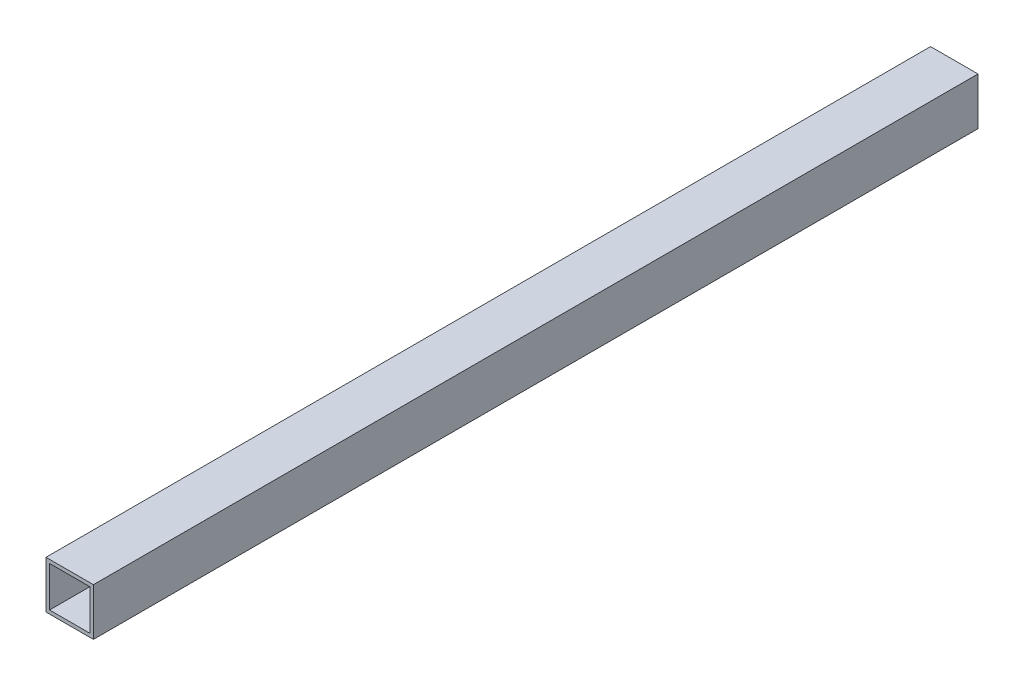
ISO-10303-21;
HEADER;
FILE_DESCRIPTION(('STEP AP214'),'2;1');
FILE_NAME('part.step','',(''),(''),'','','');
FILE_SCHEMA(('AUTOMOTIVE_DESIGN { 1 0 10303 214 1 1 1 1 }'));
ENDSEC;
DATA;
#1=APPLICATION_CONTEXT('core data for automotive mechanical design processes');
#2=APPLICATION_PROTOCOL_DEFINITION('international standard','automotive_design',2000,#1);
#3=PRODUCT_CONTEXT('',#1,'mechanical');
#4=PRODUCT('Part','Part','',(#3));
#5=PRODUCT_RELATED_PRODUCT_CATEGORY('part','',(#4));
#6=PRODUCT_DEFINITION_FORMATION('','',#4);
#7=PRODUCT_DEFINITION_CONTEXT('part definition',#1,'design');
#8=PRODUCT_DEFINITION('design','',#6,#7);
#9=PRODUCT_DEFINITION_SHAPE('','',#8);
#10=(LENGTH_UNIT() NAMED_UNIT(*) SI_UNIT(.MILLI.,.METRE.));
#11=(NAMED_UNIT(*) PLANE_ANGLE_UNIT() SI_UNIT($,.RADIAN.));
#12=(NAMED_UNIT(*) SI_UNIT($,.STERADIAN.) SOLID_ANGLE_UNIT());
#13=UNCERTAINTY_MEASURE_WITH_UNIT(LENGTH_MEASURE(1.E-05),#10,'distance_accuracy_value','');
#14=(GEOMETRIC_REPRESENTATION_CONTEXT(3) GLOBAL_UNCERTAINTY_ASSIGNED_CONTEXT((#13)) GLOBAL_UNIT_ASSIGNED_CONTEXT((#10,
#11,#12)) REPRESENTATION_CONTEXT('',''));
#15=CARTESIAN_POINT('',(0.,0.,0.));
#16=DIRECTION('',(0.,0.,1.));
#17=DIRECTION('',(1.,0.,0.));
#18=AXIS2_PLACEMENT_3D('',#15,#16,#17);
#19=CARTESIAN_POINT('',(0.,0.,373.));
#20=DIRECTION('',(0.,0.,1.));
#21=DIRECTION('',(1.,0.,0.));
#22=AXIS2_PLACEMENT_3D('',#19,#20,#21);
#23=PLANE('',#22);
#24=DIRECTION('',(0.,-1.,0.));
#25=VECTOR('',#24,1.);
#26=CARTESIAN_POINT('',(-10.,-10.,373.));
#27=LINE('',#26,#25);
#28=CARTESIAN_POINT('',(-10.,10.,373.));
#29=VERTEX_POINT('',#28);
#30=CARTESIAN_POINT('',(-10.,-10.,373.));
#31=VERTEX_POINT('',#30);
#32=EDGE_CURVE('E134',#29,#31,#27,.T.);
#33=ORIENTED_EDGE('',*,*,#32,.T.);
#34=DIRECTION('',(1.,0.,0.));
#35=VECTOR('',#34,1.);
#36=CARTESIAN_POINT('',(10.,-10.,373.));
#37=LINE('',#36,#35);
#38=CARTESIAN_POINT('',(10.,-10.,373.));
#39=VERTEX_POINT('',#38);
#40=EDGE_CURVE('E137',#31,#39,#37,.T.);
#41=ORIENTED_EDGE('',*,*,#40,.T.);
#42=DIRECTION('',(0.,1.,0.));
#43=VECTOR('',#42,1.);
#44=CARTESIAN_POINT('',(10.,-10.,373.));
#45=LINE('',#44,#43);
#46=CARTESIAN_POINT('',(10.,10.,373.));
#47=VERTEX_POINT('',#46);
#48=EDGE_CURVE('E140',#39,#47,#45,.T.);
#49=ORIENTED_EDGE('',*,*,#48,.T.);
#50=DIRECTION('',(-1.,0.,0.));
#51=VECTOR('',#50,1.);
#52=CARTESIAN_POINT('',(10.,10.,373.));
#53=LINE('',#52,#51);
#54=EDGE_CURVE('E142',#47,#29,#53,.T.);
#55=ORIENTED_EDGE('',*,*,#54,.T.);
#56=EDGE_LOOP('',(#33,#41,#49,#55));
#57=FACE_BOUND('',#56,.T.);
#58=DIRECTION('',(-1.,0.,0.));
#59=VECTOR('',#58,1.);
#60=CARTESIAN_POINT('',(8.5,8.5,373.));
#61=LINE('',#60,#59);
#62=CARTESIAN_POINT('',(8.5,8.5,373.));
#63=VERTEX_POINT('',#62);
#64=CARTESIAN_POINT('',(-8.5,8.49999999999999,373.));
#65=VERTEX_POINT('',#64);
#66=EDGE_CURVE('E106',#63,#65,#61,.T.);
#67=ORIENTED_EDGE('',*,*,#66,.F.);
#68=DIRECTION('',(0.,1.,0.));
#69=VECTOR('',#68,1.);
#70=CARTESIAN_POINT('',(8.5,-8.5,373.));
#71=LINE('',#70,#69);
#72=CARTESIAN_POINT('',(8.5,-8.5,373.));
#73=VERTEX_POINT('',#72);
#74=EDGE_CURVE('E98',#73,#63,#71,.T.);
#75=ORIENTED_EDGE('',*,*,#74,.F.);
#76=DIRECTION('',(1.,0.,0.));
#77=VECTOR('',#76,1.);
#78=CARTESIAN_POINT('',(8.5,-8.5,373.));
#79=LINE('',#78,#77);
#80=CARTESIAN_POINT('',(-8.5,-8.5,373.));
#81=VERTEX_POINT('',#80);
#82=EDGE_CURVE('E120',#81,#73,#79,.T.);
#83=ORIENTED_EDGE('',*,*,#82,.F.);
#84=DIRECTION('',(0.,-1.,0.));
#85=VECTOR('',#84,1.);
#86=CARTESIAN_POINT('',(-8.5,-8.5,373.));
#87=LINE('',#86,#85);
#88=EDGE_CURVE('E118',#65,#81,#87,.T.);
#89=ORIENTED_EDGE('',*,*,#88,.F.);
#90=EDGE_LOOP('',(#67,#75,#83,#89));
#91=FACE_BOUND('',#90,.T.);
#92=ADVANCED_FACE('F33',(#57,#91),#23,.T.);
#93=CARTESIAN_POINT('',(0.,0.,0.));
#94=DIRECTION('',(0.,0.,1.));
#95=DIRECTION('',(1.,0.,0.));
#96=AXIS2_PLACEMENT_3D('',#93,#94,#95);
#97=PLANE('',#96);
#98=DIRECTION('',(0.,-1.,0.));
#99=VECTOR('',#98,1.);
#100=CARTESIAN_POINT('',(-10.,-10.,0.));
#101=LINE('',#100,#99);
#102=CARTESIAN_POINT('',(-10.,10.,0.));
#103=VERTEX_POINT('',#102);
#104=CARTESIAN_POINT('',(-10.,-10.,0.));
#105=VERTEX_POINT('',#104);
#106=EDGE_CURVE('E114',#103,#105,#101,.T.);
#107=ORIENTED_EDGE('',*,*,#106,.F.);
#108=DIRECTION('',(-1.,0.,0.));
#109=VECTOR('',#108,1.);
#110=CARTESIAN_POINT('',(10.,10.,0.));
#111=LINE('',#110,#109);
#112=CARTESIAN_POINT('',(10.,10.,0.));
#113=VERTEX_POINT('',#112);
#114=EDGE_CURVE('E138',#113,#103,#111,.T.);
#115=ORIENTED_EDGE('',*,*,#114,.F.);
#116=DIRECTION('',(0.,1.,0.));
#117=VECTOR('',#116,1.);
#118=CARTESIAN_POINT('',(10.,-10.,0.));
#119=LINE('',#118,#117);
#120=CARTESIAN_POINT('',(10.,-10.,0.));
#121=VERTEX_POINT('',#120);
#122=EDGE_CURVE('E149',#121,#113,#119,.T.);
#123=ORIENTED_EDGE('',*,*,#122,.F.);
#124=DIRECTION('',(1.,0.,0.));
#125=VECTOR('',#124,1.);
#126=CARTESIAN_POINT('',(10.,-10.,0.));
#127=LINE('',#126,#125);
#128=EDGE_CURVE('E147',#105,#121,#127,.T.);
#129=ORIENTED_EDGE('',*,*,#128,.F.);
#130=EDGE_LOOP('',(#107,#115,#123,#129));
#131=FACE_BOUND('',#130,.T.);
#132=DIRECTION('',(0.,1.,0.));
#133=VECTOR('',#132,1.);
#134=CARTESIAN_POINT('',(8.5,-8.5,0.));
#135=LINE('',#134,#133);
#136=CARTESIAN_POINT('',(8.5,-8.5,0.));
#137=VERTEX_POINT('',#136);
#138=CARTESIAN_POINT('',(8.5,8.5,0.));
#139=VERTEX_POINT('',#138);
#140=EDGE_CURVE('E56',#137,#139,#135,.T.);
#141=ORIENTED_EDGE('',*,*,#140,.T.);
#142=DIRECTION('',(-1.,0.,0.));
#143=VECTOR('',#142,1.);
#144=CARTESIAN_POINT('',(8.5,8.5,0.));
#145=LINE('',#144,#143);
#146=CARTESIAN_POINT('',(-8.5,8.49999999999999,0.));
#147=VERTEX_POINT('',#146);
#148=EDGE_CURVE('E113',#139,#147,#145,.T.);
#149=ORIENTED_EDGE('',*,*,#148,.T.);
#150=DIRECTION('',(0.,-1.,0.));
#151=VECTOR('',#150,1.);
#152=CARTESIAN_POINT('',(-8.5,-8.5,0.));
#153=LINE('',#152,#151);
#154=CARTESIAN_POINT('',(-8.5,-8.5,0.));
#155=VERTEX_POINT('',#154);
#156=EDGE_CURVE('E126',#147,#155,#153,.T.);
#157=ORIENTED_EDGE('',*,*,#156,.T.);
#158=DIRECTION('',(1.,0.,0.));
#159=VECTOR('',#158,1.);
#160=CARTESIAN_POINT('',(8.5,-8.5,0.));
#161=LINE('',#160,#159);
#162=EDGE_CURVE('E107',#155,#137,#161,.T.);
#163=ORIENTED_EDGE('',*,*,#162,.T.);
#164=EDGE_LOOP('',(#141,#149,#157,#163));
#165=FACE_BOUND('',#164,.T.);
#166=ADVANCED_FACE('F167',(#131,#165),#97,.F.);
#167=CARTESIAN_POINT('',(-10.,-10.,373.));
#168=DIRECTION('',(1.,0.,0.));
#169=DIRECTION('',(0.,0.,-1.));
#170=AXIS2_PLACEMENT_3D('',#167,#168,#169);
#171=PLANE('',#170);
#172=ORIENTED_EDGE('',*,*,#106,.T.);
#173=DIRECTION('',(0.,0.,-1.));
#174=VECTOR('',#173,1.);
#175=CARTESIAN_POINT('',(-10.,-10.,373.));
#176=LINE('',#175,#174);
#177=EDGE_CURVE('E11',#31,#105,#176,.T.);
#178=ORIENTED_EDGE('',*,*,#177,.F.);
#179=ORIENTED_EDGE('',*,*,#32,.F.);
#180=DIRECTION('',(0.,0.,-1.));
#181=VECTOR('',#180,1.);
#182=CARTESIAN_POINT('',(-10.,10.,373.));
#183=LINE('',#182,#181);
#184=EDGE_CURVE('E144',#29,#103,#183,.T.);
#185=ORIENTED_EDGE('',*,*,#184,.T.);
#186=EDGE_LOOP('',(#172,#178,#179,#185));
#187=FACE_BOUND('',#186,.T.);
#188=ADVANCED_FACE('F35',(#187),#171,.F.);
#189=CARTESIAN_POINT('',(10.,-10.,373.));
#190=DIRECTION('',(0.,1.,0.));
#191=DIRECTION('',(-1.,0.,0.));
#192=AXIS2_PLACEMENT_3D('',#189,#190,#191);
#193=PLANE('',#192);
#194=ORIENTED_EDGE('',*,*,#128,.T.);
#195=DIRECTION('',(0.,0.,-1.));
#196=VECTOR('',#195,1.);
#197=CARTESIAN_POINT('',(10.,-10.,373.));
#198=LINE('',#197,#196);
#199=EDGE_CURVE('E41',#39,#121,#198,.T.);
#200=ORIENTED_EDGE('',*,*,#199,.F.);
#201=ORIENTED_EDGE('',*,*,#40,.F.);
#202=ORIENTED_EDGE('',*,*,#177,.T.);
#203=EDGE_LOOP('',(#194,#200,#201,#202));
#204=FACE_BOUND('',#203,.T.);
#205=ADVANCED_FACE('F177',(#204),#193,.F.);
#206=CARTESIAN_POINT('',(10.,-10.,373.));
#207=DIRECTION('',(-1.,0.,0.));
#208=DIRECTION('',(0.,0.,1.));
#209=AXIS2_PLACEMENT_3D('',#206,#207,#208);
#210=PLANE('',#209);
#211=ORIENTED_EDGE('',*,*,#122,.T.);
#212=DIRECTION('',(0.,0.,-1.));
#213=VECTOR('',#212,1.);
#214=CARTESIAN_POINT('',(10.,10.,373.));
#215=LINE('',#214,#213);
#216=EDGE_CURVE('E154',#47,#113,#215,.T.);
#217=ORIENTED_EDGE('',*,*,#216,.F.);
#218=ORIENTED_EDGE('',*,*,#48,.F.);
#219=ORIENTED_EDGE('',*,*,#199,.T.);
#220=EDGE_LOOP('',(#211,#217,#218,#219));
#221=FACE_BOUND('',#220,.T.);
#222=ADVANCED_FACE('F161',(#221),#210,.F.);
#223=CARTESIAN_POINT('',(10.,10.,373.));
#224=DIRECTION('',(0.,-1.,0.));
#225=DIRECTION('',(1.,0.,0.));
#226=AXIS2_PLACEMENT_3D('',#223,#224,#225);
#227=PLANE('',#226);
#228=ORIENTED_EDGE('',*,*,#114,.T.);
#229=ORIENTED_EDGE('',*,*,#184,.F.);
#230=ORIENTED_EDGE('',*,*,#54,.F.);
#231=ORIENTED_EDGE('',*,*,#216,.T.);
#232=EDGE_LOOP('',(#228,#229,#230,#231));
#233=FACE_BOUND('',#232,.T.);
#234=ADVANCED_FACE('F171',(#233),#227,.F.);
#235=CARTESIAN_POINT('',(8.5,-8.5,373.));
#236=DIRECTION('',(-1.,0.,0.));
#237=DIRECTION('',(0.,0.,1.));
#238=AXIS2_PLACEMENT_3D('',#235,#236,#237);
#239=PLANE('',#238);
#240=ORIENTED_EDGE('',*,*,#140,.F.);
#241=DIRECTION('',(0.,0.,-1.));
#242=VECTOR('',#241,1.);
#243=CARTESIAN_POINT('',(8.5,-8.5,373.));
#244=LINE('',#243,#242);
#245=EDGE_CURVE('E102',#73,#137,#244,.T.);
#246=ORIENTED_EDGE('',*,*,#245,.F.);
#247=ORIENTED_EDGE('',*,*,#74,.T.);
#248=DIRECTION('',(0.,0.,-1.));
#249=VECTOR('',#248,1.);
#250=CARTESIAN_POINT('',(8.5,8.5,373.));
#251=LINE('',#250,#249);
#252=EDGE_CURVE('E101',#63,#139,#251,.T.);
#253=ORIENTED_EDGE('',*,*,#252,.T.);
#254=EDGE_LOOP('',(#240,#246,#247,#253));
#255=FACE_BOUND('',#254,.T.);
#256=ADVANCED_FACE('F100',(#255),#239,.T.);
#257=CARTESIAN_POINT('',(8.5,8.5,373.));
#258=DIRECTION('',(0.,-1.,0.));
#259=DIRECTION('',(1.,0.,0.));
#260=AXIS2_PLACEMENT_3D('',#257,#258,#259);
#261=PLANE('',#260);
#262=ORIENTED_EDGE('',*,*,#148,.F.);
#263=ORIENTED_EDGE('',*,*,#252,.F.);
#264=ORIENTED_EDGE('',*,*,#66,.T.);
#265=DIRECTION('',(0.,0.,-1.));
#266=VECTOR('',#265,1.);
#267=CARTESIAN_POINT('',(-8.5,8.49999999999999,373.));
#268=LINE('',#267,#266);
#269=EDGE_CURVE('E115',#65,#147,#268,.T.);
#270=ORIENTED_EDGE('',*,*,#269,.T.);
#271=EDGE_LOOP('',(#262,#263,#264,#270));
#272=FACE_BOUND('',#271,.T.);
#273=ADVANCED_FACE('F110',(#272),#261,.T.);
#274=CARTESIAN_POINT('',(-8.5,-8.5,373.));
#275=DIRECTION('',(1.,0.,0.));
#276=DIRECTION('',(0.,1.,0.));
#277=AXIS2_PLACEMENT_3D('',#274,#275,#276);
#278=PLANE('',#277);
#279=ORIENTED_EDGE('',*,*,#156,.F.);
#280=ORIENTED_EDGE('',*,*,#269,.F.);
#281=ORIENTED_EDGE('',*,*,#88,.T.);
#282=DIRECTION('',(0.,0.,-1.));
#283=VECTOR('',#282,1.);
#284=CARTESIAN_POINT('',(-8.5,-8.5,373.));
#285=LINE('',#284,#283);
#286=EDGE_CURVE('E48',#81,#155,#285,.T.);
#287=ORIENTED_EDGE('',*,*,#286,.T.);
#288=EDGE_LOOP('',(#279,#280,#281,#287));
#289=FACE_BOUND('',#288,.T.);
#290=ADVANCED_FACE('F200',(#289),#278,.T.);
#291=CARTESIAN_POINT('',(8.5,-8.5,373.));
#292=DIRECTION('',(0.,1.,0.));
#293=DIRECTION('',(-1.,0.,0.));
#294=AXIS2_PLACEMENT_3D('',#291,#292,#293);
#295=PLANE('',#294);
#296=ORIENTED_EDGE('',*,*,#162,.F.);
#297=ORIENTED_EDGE('',*,*,#286,.F.);
#298=ORIENTED_EDGE('',*,*,#82,.T.);
#299=ORIENTED_EDGE('',*,*,#245,.T.);
#300=EDGE_LOOP('',(#296,#297,#298,#299));
#301=FACE_BOUND('',#300,.T.);
#302=ADVANCED_FACE('F204',(#301),#295,.T.);
#303=CLOSED_SHELL('',(#92,#166,#188,#205,#222,#234,#256,#273,#290,#302));
#304=MANIFOLD_SOLID_BREP('B2',#303);
#305=ADVANCED_BREP_SHAPE_REPRESENTATION('',(#18,#304),#14);
#306=SHAPE_DEFINITION_REPRESENTATION(#9,#305);
ENDSEC;
END-ISO-10303-21;
